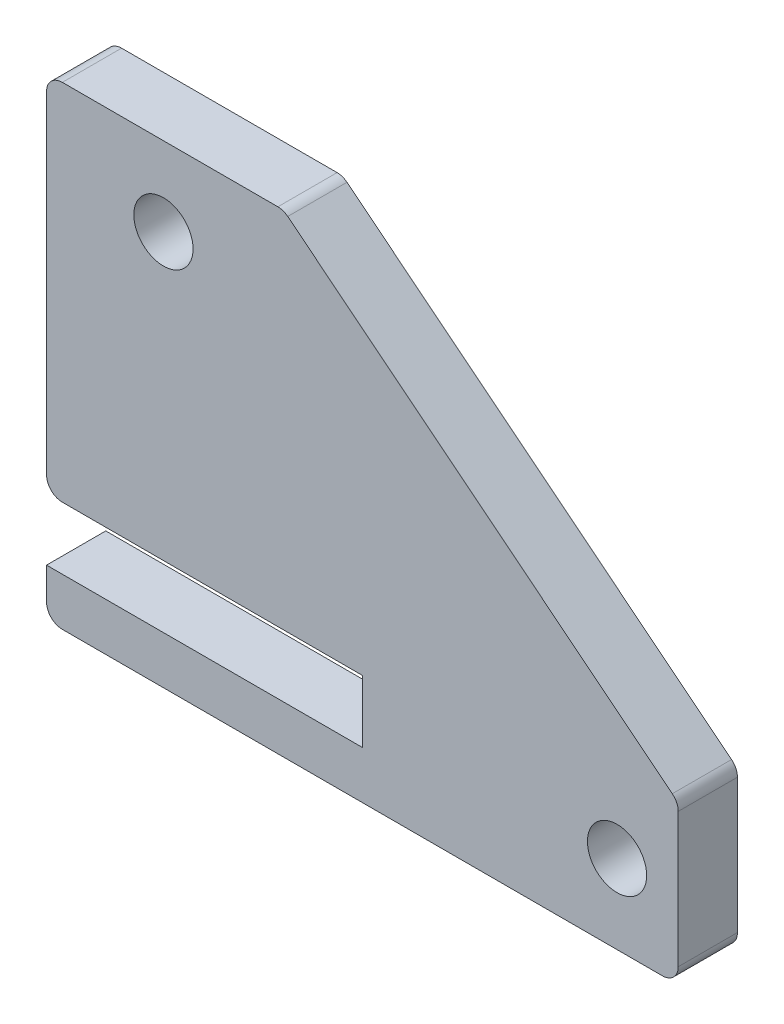
ISO-10303-21;
HEADER;
FILE_DESCRIPTION(('STEP AP214'),'2;1');
FILE_NAME('part.step','',(''),(''),'','','');
FILE_SCHEMA(('AUTOMOTIVE_DESIGN { 1 0 10303 214 1 1 1 1 }'));
ENDSEC;
DATA;
#1=APPLICATION_CONTEXT('core data for automotive mechanical design processes');
#2=APPLICATION_PROTOCOL_DEFINITION('international standard','automotive_design',2000,#1);
#3=PRODUCT_CONTEXT('',#1,'mechanical');
#4=PRODUCT('Part','Part','',(#3));
#5=PRODUCT_RELATED_PRODUCT_CATEGORY('part','',(#4));
#6=PRODUCT_DEFINITION_FORMATION('','',#4);
#7=PRODUCT_DEFINITION_CONTEXT('part definition',#1,'design');
#8=PRODUCT_DEFINITION('design','',#6,#7);
#9=PRODUCT_DEFINITION_SHAPE('','',#8);
#10=(LENGTH_UNIT() NAMED_UNIT(*) SI_UNIT(.MILLI.,.METRE.));
#11=(NAMED_UNIT(*) PLANE_ANGLE_UNIT() SI_UNIT($,.RADIAN.));
#12=(NAMED_UNIT(*) SI_UNIT($,.STERADIAN.) SOLID_ANGLE_UNIT());
#13=UNCERTAINTY_MEASURE_WITH_UNIT(LENGTH_MEASURE(1.E-05),#10,'distance_accuracy_value','');
#14=(GEOMETRIC_REPRESENTATION_CONTEXT(3) GLOBAL_UNCERTAINTY_ASSIGNED_CONTEXT((#13)) GLOBAL_UNIT_ASSIGNED_CONTEXT((#10,
#11,#12)) REPRESENTATION_CONTEXT('',''));
#15=CARTESIAN_POINT('',(0.,0.,0.));
#16=DIRECTION('',(0.,0.,1.));
#17=DIRECTION('',(1.,0.,0.));
#18=AXIS2_PLACEMENT_3D('',#15,#16,#17);
#19=CARTESIAN_POINT('',(-25.4,0.,2.38125));
#20=DIRECTION('',(-1.,0.,0.));
#21=DIRECTION('',(0.,0.,1.));
#22=AXIS2_PLACEMENT_3D('',#19,#20,#21);
#23=PLANE('',#22);
#24=DIRECTION('',(0.,1.,0.));
#25=VECTOR('',#24,1.);
#26=CARTESIAN_POINT('',(-25.4,0.,-2.38125));
#27=LINE('',#26,#25);
#28=CARTESIAN_POINT('',(-25.4,3.77825,-2.38125));
#29=VERTEX_POINT('',#28);
#30=CARTESIAN_POINT('',(-25.4,30.48,-2.38125));
#31=VERTEX_POINT('',#30);
#32=EDGE_CURVE('E188',#29,#31,#27,.T.);
#33=ORIENTED_EDGE('',*,*,#32,.F.);
#34=DIRECTION('',(0.,0.,-1.));
#35=VECTOR('',#34,1.);
#36=CARTESIAN_POINT('',(-25.4,3.77825,2.38125));
#37=LINE('',#36,#35);
#38=CARTESIAN_POINT('',(-25.4,3.77825,2.38125));
#39=VERTEX_POINT('',#38);
#40=EDGE_CURVE('E250',#29,#39,#37,.F.);
#41=ORIENTED_EDGE('',*,*,#40,.T.);
#42=DIRECTION('',(0.,1.,0.));
#43=VECTOR('',#42,1.);
#44=CARTESIAN_POINT('',(-25.4,0.,2.38125));
#45=LINE('',#44,#43);
#46=CARTESIAN_POINT('',(-25.4,30.48,2.38125));
#47=VERTEX_POINT('',#46);
#48=EDGE_CURVE('E158',#39,#47,#45,.T.);
#49=ORIENTED_EDGE('',*,*,#48,.T.);
#50=DIRECTION('',(0.,0.,-1.));
#51=VECTOR('',#50,1.);
#52=CARTESIAN_POINT('',(-25.4,30.48,2.38125));
#53=LINE('',#52,#51);
#54=EDGE_CURVE('E248',#47,#31,#53,.T.);
#55=ORIENTED_EDGE('',*,*,#54,.T.);
#56=EDGE_LOOP('',(#33,#41,#49,#55));
#57=FACE_BOUND('',#56,.T.);
#58=ADVANCED_FACE('F35',(#57),#23,.T.);
#59=CARTESIAN_POINT('',(0.,2.50825,2.38125));
#60=DIRECTION('',(0.,1.,0.));
#61=DIRECTION('',(0.,0.,1.));
#62=AXIS2_PLACEMENT_3D('',#59,#60,#61);
#63=PLANE('',#62);
#64=DIRECTION('',(1.,0.,0.));
#65=VECTOR('',#64,1.);
#66=CARTESIAN_POINT('',(0.,2.50825,2.38125));
#67=LINE('',#66,#65);
#68=CARTESIAN_POINT('',(-24.13,2.50825,2.38125));
#69=VERTEX_POINT('',#68);
#70=CARTESIAN_POINT('',(0.,2.50825,2.38125));
#71=VERTEX_POINT('',#70);
#72=EDGE_CURVE('E143',#69,#71,#67,.T.);
#73=ORIENTED_EDGE('',*,*,#72,.F.);
#74=DIRECTION('',(0.,0.,-1.));
#75=VECTOR('',#74,1.);
#76=CARTESIAN_POINT('',(-24.13,2.50825,-2.38125));
#77=LINE('',#76,#75);
#78=CARTESIAN_POINT('',(-24.13,2.50825,-2.38125));
#79=VERTEX_POINT('',#78);
#80=EDGE_CURVE('E246',#69,#79,#77,.T.);
#81=ORIENTED_EDGE('',*,*,#80,.T.);
#82=DIRECTION('',(1.,0.,0.));
#83=VECTOR('',#82,1.);
#84=CARTESIAN_POINT('',(0.,2.50825,-2.38125));
#85=LINE('',#84,#83);
#86=CARTESIAN_POINT('',(0.,2.50825,-2.38125));
#87=VERTEX_POINT('',#86);
#88=EDGE_CURVE('E163',#79,#87,#85,.T.);
#89=ORIENTED_EDGE('',*,*,#88,.T.);
#90=DIRECTION('',(0.,0.,-1.));
#91=VECTOR('',#90,1.);
#92=CARTESIAN_POINT('',(0.,2.50825,2.38125));
#93=LINE('',#92,#91);
#94=EDGE_CURVE('E161',#71,#87,#93,.T.);
#95=ORIENTED_EDGE('',*,*,#94,.F.);
#96=EDGE_LOOP('',(#73,#81,#89,#95));
#97=FACE_BOUND('',#96,.T.);
#98=ADVANCED_FACE('F162',(#97),#63,.F.);
#99=CARTESIAN_POINT('',(0.,0.,2.38125));
#100=DIRECTION('',(-1.,0.,0.));
#101=DIRECTION('',(0.,0.,1.));
#102=AXIS2_PLACEMENT_3D('',#99,#100,#101);
#103=PLANE('',#102);
#104=DIRECTION('',(0.,1.,0.));
#105=VECTOR('',#104,1.);
#106=CARTESIAN_POINT('',(0.,0.,-2.38125));
#107=LINE('',#106,#105);
#108=CARTESIAN_POINT('',(0.,-2.50825,-2.38125));
#109=VERTEX_POINT('',#108);
#110=EDGE_CURVE('E192',#109,#87,#107,.T.);
#111=ORIENTED_EDGE('',*,*,#110,.F.);
#112=DIRECTION('',(0.,0.,-1.));
#113=VECTOR('',#112,1.);
#114=CARTESIAN_POINT('',(0.,-2.50825,2.38125));
#115=LINE('',#114,#113);
#116=CARTESIAN_POINT('',(0.,-2.50825,2.38125));
#117=VERTEX_POINT('',#116);
#118=EDGE_CURVE('E168',#117,#109,#115,.T.);
#119=ORIENTED_EDGE('',*,*,#118,.F.);
#120=DIRECTION('',(0.,1.,0.));
#121=VECTOR('',#120,1.);
#122=CARTESIAN_POINT('',(0.,0.,2.38125));
#123=LINE('',#122,#121);
#124=EDGE_CURVE('E150',#117,#71,#123,.T.);
#125=ORIENTED_EDGE('',*,*,#124,.T.);
#126=ORIENTED_EDGE('',*,*,#94,.T.);
#127=EDGE_LOOP('',(#111,#119,#125,#126));
#128=FACE_BOUND('',#127,.T.);
#129=ADVANCED_FACE('F170',(#128),#103,.T.);
#130=CARTESIAN_POINT('',(0.,-2.50825,2.38125));
#131=DIRECTION('',(0.,1.,0.));
#132=DIRECTION('',(0.,0.,1.));
#133=AXIS2_PLACEMENT_3D('',#130,#131,#132);
#134=PLANE('',#133);
#135=DIRECTION('',(1.,0.,0.));
#136=VECTOR('',#135,1.);
#137=CARTESIAN_POINT('',(0.,-2.50825,-2.38125));
#138=LINE('',#137,#136);
#139=CARTESIAN_POINT('',(-25.4,-2.50825,-2.38125));
#140=VERTEX_POINT('',#139);
#141=EDGE_CURVE('E194',#140,#109,#138,.T.);
#142=ORIENTED_EDGE('',*,*,#141,.F.);
#143=DIRECTION('',(0.,0.,-1.));
#144=VECTOR('',#143,1.);
#145=CARTESIAN_POINT('',(-25.4,-2.50825,2.38125));
#146=LINE('',#145,#144);
#147=CARTESIAN_POINT('',(-25.4,-2.50825,2.38125));
#148=VERTEX_POINT('',#147);
#149=EDGE_CURVE('E187',#148,#140,#146,.T.);
#150=ORIENTED_EDGE('',*,*,#149,.F.);
#151=DIRECTION('',(1.,0.,0.));
#152=VECTOR('',#151,1.);
#153=CARTESIAN_POINT('',(0.,-2.50825,2.38125));
#154=LINE('',#153,#152);
#155=EDGE_CURVE('E171',#148,#117,#154,.T.);
#156=ORIENTED_EDGE('',*,*,#155,.T.);
#157=ORIENTED_EDGE('',*,*,#118,.T.);
#158=EDGE_LOOP('',(#142,#150,#156,#157));
#159=FACE_BOUND('',#158,.T.);
#160=ADVANCED_FACE('F282',(#159),#134,.T.);
#161=CARTESIAN_POINT('',(-25.4,0.,2.38125));
#162=DIRECTION('',(1.,0.,0.));
#163=DIRECTION('',(0.,0.,-1.));
#164=AXIS2_PLACEMENT_3D('',#161,#162,#163);
#165=PLANE('',#164);
#166=DIRECTION('',(0.,-1.,0.));
#167=VECTOR('',#166,1.);
#168=CARTESIAN_POINT('',(-25.4,0.,-2.38125));
#169=LINE('',#168,#167);
#170=CARTESIAN_POINT('',(-25.4,-5.08,-2.38125));
#171=VERTEX_POINT('',#170);
#172=EDGE_CURVE('E197',#140,#171,#169,.T.);
#173=ORIENTED_EDGE('',*,*,#172,.T.);
#174=DIRECTION('',(0.,0.,-1.));
#175=VECTOR('',#174,1.);
#176=CARTESIAN_POINT('',(-25.4,-5.08,2.38125));
#177=LINE('',#176,#175);
#178=CARTESIAN_POINT('',(-25.4,-5.08,2.38125));
#179=VERTEX_POINT('',#178);
#180=EDGE_CURVE('E11',#171,#179,#177,.F.);
#181=ORIENTED_EDGE('',*,*,#180,.T.);
#182=DIRECTION('',(0.,-1.,0.));
#183=VECTOR('',#182,1.);
#184=CARTESIAN_POINT('',(-25.4,0.,2.38125));
#185=LINE('',#184,#183);
#186=EDGE_CURVE('E173',#148,#179,#185,.T.);
#187=ORIENTED_EDGE('',*,*,#186,.F.);
#188=ORIENTED_EDGE('',*,*,#149,.T.);
#189=EDGE_LOOP('',(#173,#181,#187,#188));
#190=FACE_BOUND('',#189,.T.);
#191=ADVANCED_FACE('F279',(#190),#165,.F.);
#192=CARTESIAN_POINT('',(0.,-6.35,2.38125));
#193=DIRECTION('',(0.,1.,0.));
#194=DIRECTION('',(0.,0.,1.));
#195=AXIS2_PLACEMENT_3D('',#192,#193,#194);
#196=PLANE('',#195);
#197=DIRECTION('',(1.,0.,0.));
#198=VECTOR('',#197,1.);
#199=CARTESIAN_POINT('',(0.,-6.35,2.38125));
#200=LINE('',#199,#198);
#201=CARTESIAN_POINT('',(-24.13,-6.35,2.38125));
#202=VERTEX_POINT('',#201);
#203=CARTESIAN_POINT('',(24.13,-6.35,2.38125));
#204=VERTEX_POINT('',#203);
#205=EDGE_CURVE('E179',#202,#204,#200,.T.);
#206=ORIENTED_EDGE('',*,*,#205,.F.);
#207=DIRECTION('',(0.,0.,-1.));
#208=VECTOR('',#207,1.);
#209=CARTESIAN_POINT('',(-24.13,-6.35,2.38125));
#210=LINE('',#209,#208);
#211=CARTESIAN_POINT('',(-24.13,-6.35,-2.38125));
#212=VERTEX_POINT('',#211);
#213=EDGE_CURVE('E43',#202,#212,#210,.T.);
#214=ORIENTED_EDGE('',*,*,#213,.T.);
#215=DIRECTION('',(1.,0.,0.));
#216=VECTOR('',#215,1.);
#217=CARTESIAN_POINT('',(0.,-6.35,-2.38125));
#218=LINE('',#217,#216);
#219=CARTESIAN_POINT('',(24.13,-6.35,-2.38125));
#220=VERTEX_POINT('',#219);
#221=EDGE_CURVE('E200',#212,#220,#218,.T.);
#222=ORIENTED_EDGE('',*,*,#221,.T.);
#223=DIRECTION('',(0.,0.,-1.));
#224=VECTOR('',#223,1.);
#225=CARTESIAN_POINT('',(24.13,-6.35,2.38125));
#226=LINE('',#225,#224);
#227=EDGE_CURVE('E252',#220,#204,#226,.F.);
#228=ORIENTED_EDGE('',*,*,#227,.T.);
#229=EDGE_LOOP('',(#206,#214,#222,#228));
#230=FACE_BOUND('',#229,.T.);
#231=ADVANCED_FACE('F258',(#230),#196,.F.);
#232=CARTESIAN_POINT('',(25.4,0.,2.38125));
#233=DIRECTION('',(-1.,0.,0.));
#234=DIRECTION('',(0.,0.,1.));
#235=AXIS2_PLACEMENT_3D('',#232,#233,#234);
#236=PLANE('',#235);
#237=DIRECTION('',(0.,1.,0.));
#238=VECTOR('',#237,1.);
#239=CARTESIAN_POINT('',(25.4,0.,-2.38125));
#240=LINE('',#239,#238);
#241=CARTESIAN_POINT('',(25.4,-5.08,-2.38125));
#242=VERTEX_POINT('',#241);
#243=CARTESIAN_POINT('',(25.4,5.73960644369206,-2.38125));
#244=VERTEX_POINT('',#243);
#245=EDGE_CURVE('E203',#242,#244,#240,.T.);
#246=ORIENTED_EDGE('',*,*,#245,.T.);
#247=DIRECTION('',(0.,0.,1.));
#248=VECTOR('',#247,1.);
#249=CARTESIAN_POINT('',(25.4,5.73960644369206,2.38125));
#250=LINE('',#249,#248);
#251=CARTESIAN_POINT('',(25.4,5.73960644369206,2.38125));
#252=VERTEX_POINT('',#251);
#253=EDGE_CURVE('E213',#244,#252,#250,.T.);
#254=ORIENTED_EDGE('',*,*,#253,.T.);
#255=DIRECTION('',(0.,1.,0.));
#256=VECTOR('',#255,1.);
#257=CARTESIAN_POINT('',(25.4,0.,2.38125));
#258=LINE('',#257,#256);
#259=CARTESIAN_POINT('',(25.4,-5.08,2.38125));
#260=VERTEX_POINT('',#259);
#261=EDGE_CURVE('E182',#260,#252,#258,.T.);
#262=ORIENTED_EDGE('',*,*,#261,.F.);
#263=DIRECTION('',(0.,0.,-1.));
#264=VECTOR('',#263,1.);
#265=CARTESIAN_POINT('',(25.4,-5.08,2.38125));
#266=LINE('',#265,#264);
#267=EDGE_CURVE('E167',#260,#242,#266,.T.);
#268=ORIENTED_EDGE('',*,*,#267,.T.);
#269=EDGE_LOOP('',(#246,#254,#262,#268));
#270=FACE_BOUND('',#269,.T.);
#271=ADVANCED_FACE('F271',(#270),#236,.F.);
#272=CARTESIAN_POINT('',(0.,31.75,2.38125));
#273=DIRECTION('',(0.,1.,0.));
#274=DIRECTION('',(0.,0.,1.));
#275=AXIS2_PLACEMENT_3D('',#272,#273,#274);
#276=PLANE('',#275);
#277=DIRECTION('',(1.,0.,0.));
#278=VECTOR('',#277,1.);
#279=CARTESIAN_POINT('',(0.,31.75,2.38125));
#280=LINE('',#279,#278);
#281=CARTESIAN_POINT('',(-24.13,31.75,2.38125));
#282=VERTEX_POINT('',#281);
#283=CARTESIAN_POINT('',(-6.79549194538493,31.75,2.38125));
#284=VERTEX_POINT('',#283);
#285=EDGE_CURVE('E184',#282,#284,#280,.T.);
#286=ORIENTED_EDGE('',*,*,#285,.T.);
#287=DIRECTION('',(0.,0.,1.));
#288=VECTOR('',#287,1.);
#289=CARTESIAN_POINT('',(-6.79549194538493,31.75,-2.38125));
#290=LINE('',#289,#288);
#291=CARTESIAN_POINT('',(-6.79549194538493,31.75,-2.38125));
#292=VERTEX_POINT('',#291);
#293=EDGE_CURVE('E244',#284,#292,#290,.F.);
#294=ORIENTED_EDGE('',*,*,#293,.T.);
#295=DIRECTION('',(1.,0.,0.));
#296=VECTOR('',#295,1.);
#297=CARTESIAN_POINT('',(0.,31.75,-2.38125));
#298=LINE('',#297,#296);
#299=CARTESIAN_POINT('',(-24.13,31.75,-2.38125));
#300=VERTEX_POINT('',#299);
#301=EDGE_CURVE('E206',#300,#292,#298,.T.);
#302=ORIENTED_EDGE('',*,*,#301,.F.);
#303=DIRECTION('',(0.,0.,-1.));
#304=VECTOR('',#303,1.);
#305=CARTESIAN_POINT('',(-24.13,31.75,2.38125));
#306=LINE('',#305,#304);
#307=EDGE_CURVE('E242',#300,#282,#306,.F.);
#308=ORIENTED_EDGE('',*,*,#307,.T.);
#309=EDGE_LOOP('',(#286,#294,#302,#308));
#310=FACE_BOUND('',#309,.T.);
#311=ADVANCED_FACE('F382',(#310),#276,.T.);
#312=CARTESIAN_POINT('',(0.,0.,2.38125));
#313=DIRECTION('',(0.,0.,1.));
#314=DIRECTION('',(1.,0.,0.));
#315=AXIS2_PLACEMENT_3D('',#312,#313,#314);
#316=PLANE('',#315);
#317=ORIENTED_EDGE('',*,*,#261,.T.);
#318=CARTESIAN_POINT('',(24.13,5.73960644369206,2.38125));
#319=DIRECTION('',(0.,0.,1.));
#320=DIRECTION('',(1.,0.,0.));
#321=AXIS2_PLACEMENT_3D('',#318,#319,#320);
#322=CIRCLE('',#321,1.27);
#323=CARTESIAN_POINT('',(24.9233627103941,6.7313098316847,2.38125));
#324=VERTEX_POINT('',#323);
#325=EDGE_CURVE('E225',#252,#324,#322,.T.);
#326=ORIENTED_EDGE('',*,*,#325,.T.);
#327=DIRECTION('',(0.78086880944303,-0.624695047554424,0.));
#328=VECTOR('',#327,1.);
#329=CARTESIAN_POINT('',(-6.35,31.75,2.38125));
#330=LINE('',#329,#328);
#331=CARTESIAN_POINT('',(-6.00212923499081,31.4717033879926,2.38125));
#332=VERTEX_POINT('',#331);
#333=EDGE_CURVE('E482',#332,#324,#330,.T.);
#334=ORIENTED_EDGE('',*,*,#333,.F.);
#335=CARTESIAN_POINT('',(-6.79549194538493,30.48,2.38125));
#336=DIRECTION('',(0.,0.,1.));
#337=DIRECTION('',(1.,0.,0.));
#338=AXIS2_PLACEMENT_3D('',#335,#336,#337);
#339=CIRCLE('',#338,1.27);
#340=EDGE_CURVE('E223',#332,#284,#339,.T.);
#341=ORIENTED_EDGE('',*,*,#340,.T.);
#342=ORIENTED_EDGE('',*,*,#285,.F.);
#343=CARTESIAN_POINT('',(-24.13,30.48,2.38125));
#344=DIRECTION('',(0.,0.,1.));
#345=DIRECTION('',(1.,0.,0.));
#346=AXIS2_PLACEMENT_3D('',#343,#344,#345);
#347=CIRCLE('',#346,1.27);
#348=EDGE_CURVE('E220',#282,#47,#347,.T.);
#349=ORIENTED_EDGE('',*,*,#348,.T.);
#350=ORIENTED_EDGE('',*,*,#48,.F.);
#351=CARTESIAN_POINT('',(-24.13,3.77825,2.38125));
#352=DIRECTION('',(0.,0.,1.));
#353=DIRECTION('',(1.,0.,0.));
#354=AXIS2_PLACEMENT_3D('',#351,#352,#353);
#355=CIRCLE('',#354,1.27);
#356=EDGE_CURVE('E154',#39,#69,#355,.T.);
#357=ORIENTED_EDGE('',*,*,#356,.T.);
#358=ORIENTED_EDGE('',*,*,#72,.T.);
#359=ORIENTED_EDGE('',*,*,#124,.F.);
#360=ORIENTED_EDGE('',*,*,#155,.F.);
#361=ORIENTED_EDGE('',*,*,#186,.T.);
#362=CARTESIAN_POINT('',(-24.13,-5.08,2.38125));
#363=DIRECTION('',(0.,0.,1.));
#364=DIRECTION('',(1.,0.,0.));
#365=AXIS2_PLACEMENT_3D('',#362,#363,#364);
#366=CIRCLE('',#365,1.27);
#367=EDGE_CURVE('E218',#179,#202,#366,.T.);
#368=ORIENTED_EDGE('',*,*,#367,.T.);
#369=ORIENTED_EDGE('',*,*,#205,.T.);
#370=CARTESIAN_POINT('',(24.13,-5.08,2.38125));
#371=DIRECTION('',(0.,0.,1.));
#372=DIRECTION('',(1.,0.,0.));
#373=AXIS2_PLACEMENT_3D('',#370,#371,#372);
#374=CIRCLE('',#373,1.27);
#375=EDGE_CURVE('E216',#204,#260,#374,.T.);
#376=ORIENTED_EDGE('',*,*,#375,.T.);
#377=EDGE_LOOP('',(#317,#326,#334,#341,#342,#349,#350,#357,#358,#359,#360,#361,#368,#369,#376));
#378=FACE_BOUND('',#377,.T.);
#379=CARTESIAN_POINT('',(-15.9992228055165,25.4,2.38125));
#380=DIRECTION('',(0.,0.,1.));
#381=DIRECTION('',(1.,0.,0.));
#382=AXIS2_PLACEMENT_3D('',#379,#380,#381);
#383=CIRCLE('',#382,2.38125);
#384=CARTESIAN_POINT('',(-13.6179728055165,25.4,2.38125));
#385=VERTEX_POINT('',#384);
#386=EDGE_CURVE('E467',#385,#385,#383,.T.);
#387=ORIENTED_EDGE('',*,*,#386,.F.);
#388=EDGE_LOOP('',(#387));
#389=FACE_BOUND('',#388,.T.);
#390=CARTESIAN_POINT('',(20.47875,0.,2.38125));
#391=DIRECTION('',(0.,0.,1.));
#392=DIRECTION('',(1.,0.,0.));
#393=AXIS2_PLACEMENT_3D('',#390,#391,#392);
#394=CIRCLE('',#393,2.38125);
#395=CARTESIAN_POINT('',(22.86,0.,2.38125));
#396=VERTEX_POINT('',#395);
#397=EDGE_CURVE('E461',#396,#396,#394,.T.);
#398=ORIENTED_EDGE('',*,*,#397,.F.);
#399=EDGE_LOOP('',(#398));
#400=FACE_BOUND('',#399,.T.);
#401=ADVANCED_FACE('F146',(#378,#389,#400),#316,.T.);
#402=CARTESIAN_POINT('',(0.,0.,-2.38125));
#403=DIRECTION('',(0.,0.,1.));
#404=DIRECTION('',(1.,0.,0.));
#405=AXIS2_PLACEMENT_3D('',#402,#403,#404);
#406=PLANE('',#405);
#407=CARTESIAN_POINT('',(-15.9992228055165,25.4,-2.38125));
#408=DIRECTION('',(0.,0.,1.));
#409=DIRECTION('',(1.,0.,0.));
#410=AXIS2_PLACEMENT_3D('',#407,#408,#409);
#411=CIRCLE('',#410,2.38125);
#412=CARTESIAN_POINT('',(-13.6179728055165,25.4,-2.38125));
#413=VERTEX_POINT('',#412);
#414=EDGE_CURVE('E463',#413,#413,#411,.T.);
#415=ORIENTED_EDGE('',*,*,#414,.T.);
#416=EDGE_LOOP('',(#415));
#417=FACE_BOUND('',#416,.T.);
#418=CARTESIAN_POINT('',(20.47875,0.,-2.38125));
#419=DIRECTION('',(0.,0.,1.));
#420=DIRECTION('',(1.,0.,0.));
#421=AXIS2_PLACEMENT_3D('',#418,#419,#420);
#422=CIRCLE('',#421,2.38125);
#423=CARTESIAN_POINT('',(22.86,0.,-2.38125));
#424=VERTEX_POINT('',#423);
#425=EDGE_CURVE('E190',#424,#424,#422,.T.);
#426=ORIENTED_EDGE('',*,*,#425,.T.);
#427=EDGE_LOOP('',(#426));
#428=FACE_BOUND('',#427,.T.);
#429=DIRECTION('',(0.78086880944303,-0.624695047554424,0.));
#430=VECTOR('',#429,1.);
#431=CARTESIAN_POINT('',(-6.35,31.75,-2.38125));
#432=LINE('',#431,#430);
#433=CARTESIAN_POINT('',(-6.00212923499081,31.4717033879926,-2.38125));
#434=VERTEX_POINT('',#433);
#435=CARTESIAN_POINT('',(24.9233627103941,6.7313098316847,-2.38125));
#436=VERTEX_POINT('',#435);
#437=EDGE_CURVE('E479',#434,#436,#432,.T.);
#438=ORIENTED_EDGE('',*,*,#437,.T.);
#439=CARTESIAN_POINT('',(24.13,5.73960644369206,-2.38125));
#440=DIRECTION('',(0.,0.,1.));
#441=DIRECTION('',(1.,0.,0.));
#442=AXIS2_PLACEMENT_3D('',#439,#440,#441);
#443=CIRCLE('',#442,1.27);
#444=EDGE_CURVE('E240',#436,#244,#443,.F.);
#445=ORIENTED_EDGE('',*,*,#444,.T.);
#446=ORIENTED_EDGE('',*,*,#245,.F.);
#447=CARTESIAN_POINT('',(24.13,-5.08,-2.38125));
#448=DIRECTION('',(0.,0.,1.));
#449=DIRECTION('',(1.,0.,0.));
#450=AXIS2_PLACEMENT_3D('',#447,#448,#449);
#451=CIRCLE('',#450,1.27);
#452=EDGE_CURVE('E232',#242,#220,#451,.F.);
#453=ORIENTED_EDGE('',*,*,#452,.T.);
#454=ORIENTED_EDGE('',*,*,#221,.F.);
#455=CARTESIAN_POINT('',(-24.13,-5.08,-2.38125));
#456=DIRECTION('',(0.,0.,1.));
#457=DIRECTION('',(1.,0.,0.));
#458=AXIS2_PLACEMENT_3D('',#455,#456,#457);
#459=CIRCLE('',#458,1.27);
#460=EDGE_CURVE('E234',#212,#171,#459,.F.);
#461=ORIENTED_EDGE('',*,*,#460,.T.);
#462=ORIENTED_EDGE('',*,*,#172,.F.);
#463=ORIENTED_EDGE('',*,*,#141,.T.);
#464=ORIENTED_EDGE('',*,*,#110,.T.);
#465=ORIENTED_EDGE('',*,*,#88,.F.);
#466=CARTESIAN_POINT('',(-24.13,3.77825,-2.38125));
#467=DIRECTION('',(0.,0.,1.));
#468=DIRECTION('',(1.,0.,0.));
#469=AXIS2_PLACEMENT_3D('',#466,#467,#468);
#470=CIRCLE('',#469,1.27);
#471=EDGE_CURVE('E58',#79,#29,#470,.F.);
#472=ORIENTED_EDGE('',*,*,#471,.T.);
#473=ORIENTED_EDGE('',*,*,#32,.T.);
#474=CARTESIAN_POINT('',(-24.13,30.48,-2.38125));
#475=DIRECTION('',(0.,0.,1.));
#476=DIRECTION('',(1.,0.,0.));
#477=AXIS2_PLACEMENT_3D('',#474,#475,#476);
#478=CIRCLE('',#477,1.27);
#479=EDGE_CURVE('E50',#31,#300,#478,.F.);
#480=ORIENTED_EDGE('',*,*,#479,.T.);
#481=ORIENTED_EDGE('',*,*,#301,.T.);
#482=CARTESIAN_POINT('',(-6.79549194538493,30.48,-2.38125));
#483=DIRECTION('',(0.,0.,1.));
#484=DIRECTION('',(1.,0.,0.));
#485=AXIS2_PLACEMENT_3D('',#482,#483,#484);
#486=CIRCLE('',#485,1.27);
#487=EDGE_CURVE('E238',#292,#434,#486,.F.);
#488=ORIENTED_EDGE('',*,*,#487,.T.);
#489=EDGE_LOOP('',(#438,#445,#446,#453,#454,#461,#462,#463,#464,#465,#472,#473,#480,#481,#488));
#490=FACE_BOUND('',#489,.T.);
#491=ADVANCED_FACE('F263',(#417,#428,#490),#406,.F.);
#492=CARTESIAN_POINT('',(20.47875,0.,-2.38125));
#493=DIRECTION('',(0.,0.,1.));
#494=DIRECTION('',(1.,0.,0.));
#495=AXIS2_PLACEMENT_3D('',#492,#493,#494);
#496=CYLINDRICAL_SURFACE('',#495,2.38125);
#497=CARTESIAN_POINT('',(22.86,0.,-2.38125));
#498=CARTESIAN_POINT('',(22.86,0.,-2.331640625));
#499=CARTESIAN_POINT('',(22.86,0.,-2.28203125));
#500=CARTESIAN_POINT('',(22.86,0.,-2.1828125));
#501=CARTESIAN_POINT('',(22.86,0.,-2.133203125));
#502=CARTESIAN_POINT('',(22.86,0.,-2.033984375));
#503=CARTESIAN_POINT('',(22.86,0.,-1.984375));
#504=CARTESIAN_POINT('',(22.86,0.,-1.88515625));
#505=CARTESIAN_POINT('',(22.86,0.,-1.835546875));
#506=CARTESIAN_POINT('',(22.86,0.,-1.736328125));
#507=CARTESIAN_POINT('',(22.86,0.,-1.68671875));
#508=CARTESIAN_POINT('',(22.86,0.,-1.5875));
#509=CARTESIAN_POINT('',(22.86,0.,-1.537890625));
#510=CARTESIAN_POINT('',(22.86,0.,-1.438671875));
#511=CARTESIAN_POINT('',(22.86,0.,-1.3890625));
#512=CARTESIAN_POINT('',(22.86,0.,-1.28984375));
#513=CARTESIAN_POINT('',(22.86,0.,-1.240234375));
#514=CARTESIAN_POINT('',(22.86,0.,-1.141015625));
#515=CARTESIAN_POINT('',(22.86,0.,-1.09140625));
#516=CARTESIAN_POINT('',(22.86,0.,-0.9921875));
#517=CARTESIAN_POINT('',(22.86,0.,-0.942578125));
#518=CARTESIAN_POINT('',(22.86,0.,-0.843359375));
#519=CARTESIAN_POINT('',(22.86,0.,-0.79375));
#520=CARTESIAN_POINT('',(22.86,0.,-0.69453125));
#521=CARTESIAN_POINT('',(22.86,0.,-0.644921875));
#522=CARTESIAN_POINT('',(22.86,0.,-0.545703125));
#523=CARTESIAN_POINT('',(22.86,0.,-0.49609375));
#524=CARTESIAN_POINT('',(22.86,0.,-0.396875));
#525=CARTESIAN_POINT('',(22.86,0.,-0.347265625));
#526=CARTESIAN_POINT('',(22.86,0.,-0.248046875));
#527=CARTESIAN_POINT('',(22.86,0.,-0.1984375));
#528=CARTESIAN_POINT('',(22.86,0.,-0.09921875));
#529=CARTESIAN_POINT('',(22.86,0.,-0.049609375));
#530=CARTESIAN_POINT('',(22.86,0.,0.049609375));
#531=CARTESIAN_POINT('',(22.86,0.,0.09921875));
#532=CARTESIAN_POINT('',(22.86,0.,0.1984375));
#533=CARTESIAN_POINT('',(22.86,0.,0.248046875));
#534=CARTESIAN_POINT('',(22.86,0.,0.347265625));
#535=CARTESIAN_POINT('',(22.86,0.,0.396875));
#536=CARTESIAN_POINT('',(22.86,0.,0.49609375));
#537=CARTESIAN_POINT('',(22.86,0.,0.545703125));
#538=CARTESIAN_POINT('',(22.86,0.,0.644921875));
#539=CARTESIAN_POINT('',(22.86,0.,0.69453125));
#540=CARTESIAN_POINT('',(22.86,0.,0.79375));
#541=CARTESIAN_POINT('',(22.86,0.,0.843359375));
#542=CARTESIAN_POINT('',(22.86,0.,0.942578125));
#543=CARTESIAN_POINT('',(22.86,0.,0.9921875));
#544=CARTESIAN_POINT('',(22.86,0.,1.09140625));
#545=CARTESIAN_POINT('',(22.86,0.,1.141015625));
#546=CARTESIAN_POINT('',(22.86,0.,1.240234375));
#547=CARTESIAN_POINT('',(22.86,0.,1.28984375));
#548=CARTESIAN_POINT('',(22.86,0.,1.3890625));
#549=CARTESIAN_POINT('',(22.86,0.,1.438671875));
#550=CARTESIAN_POINT('',(22.86,0.,1.537890625));
#551=CARTESIAN_POINT('',(22.86,0.,1.5875));
#552=CARTESIAN_POINT('',(22.86,0.,1.68671875));
#553=CARTESIAN_POINT('',(22.86,0.,1.736328125));
#554=CARTESIAN_POINT('',(22.86,0.,1.835546875));
#555=CARTESIAN_POINT('',(22.86,0.,1.88515625));
#556=CARTESIAN_POINT('',(22.86,0.,1.984375));
#557=CARTESIAN_POINT('',(22.86,0.,2.033984375));
#558=CARTESIAN_POINT('',(22.86,0.,2.133203125));
#559=CARTESIAN_POINT('',(22.86,0.,2.1828125));
#560=CARTESIAN_POINT('',(22.86,0.,2.28203125));
#561=CARTESIAN_POINT('',(22.86,0.,2.331640625));
#562=CARTESIAN_POINT('',(22.86,0.,2.38125));
#563=B_SPLINE_CURVE_WITH_KNOTS('',3,(#497,#498,#499,#500,#501,#502,#503,#504,#505,#506,#507,
#508,#509,#510,#511,#512,#513,#514,#515,#516,#517,#518,#519,#520,#521,#522,#523,#524,#525,#526,
#527,#528,#529,#530,#531,#532,#533,#534,#535,#536,#537,#538,#539,#540,#541,#542,#543,#544,#545,
#546,#547,#548,#549,#550,#551,#552,#553,#554,#555,#556,#557,#558,#559,#560,#561,#562),
.UNSPECIFIED.,.F.,.F.,(4,2,2,2,2,2,2,2,2,2,2,2,2,2,2,2,2,2,2,2,2,2,2,2,2,2,2,2,2,2,2,2,4),(0.,
0.148828125,0.29765625,0.446484375,0.5953125,0.744140625,0.89296875,1.041796875,1.190625,
1.339453125,1.48828125,1.637109375,1.7859375,1.934765625,2.08359375,2.232421875,2.38125,
2.530078125,2.67890625,2.827734375,2.9765625,3.125390625,3.27421875,3.423046875,3.571875,
3.720703125,3.86953125,4.018359375,4.1671875,4.316015625,4.46484375,4.613671875,4.7625),.UNSPECIFIED.);
#564=EDGE_CURVE('BSEAM369',#424,#396,#563,.T.);
#565=ORIENTED_EDGE('',*,*,#425,.F.);
#566=ORIENTED_EDGE('',*,*,#397,.T.);
#567=ORIENTED_EDGE('',*,*,#564,.T.);
#568=ORIENTED_EDGE('',*,*,#564,.F.);
#569=EDGE_LOOP('',(#565,#567,#566,#568));
#570=FACE_BOUND('',#569,.T.);
#571=ADVANCED_FACE('F369',(#570),#496,.F.);
#572=CARTESIAN_POINT('',(-15.9992228055165,25.4,-2.38125));
#573=DIRECTION('',(0.,0.,1.));
#574=DIRECTION('',(1.,0.,0.));
#575=AXIS2_PLACEMENT_3D('',#572,#573,#574);
#576=CYLINDRICAL_SURFACE('',#575,2.38125);
#577=CARTESIAN_POINT('',(-13.6179728055165,25.4,-2.38125));
#578=CARTESIAN_POINT('',(-13.6179728055165,25.4,-2.331640625));
#579=CARTESIAN_POINT('',(-13.6179728055165,25.4,-2.28203125));
#580=CARTESIAN_POINT('',(-13.6179728055165,25.4,-2.1828125));
#581=CARTESIAN_POINT('',(-13.6179728055165,25.4,-2.133203125));
#582=CARTESIAN_POINT('',(-13.6179728055165,25.4,-2.033984375));
#583=CARTESIAN_POINT('',(-13.6179728055165,25.4,-1.984375));
#584=CARTESIAN_POINT('',(-13.6179728055165,25.4,-1.88515625));
#585=CARTESIAN_POINT('',(-13.6179728055165,25.4,-1.835546875));
#586=CARTESIAN_POINT('',(-13.6179728055165,25.4,-1.736328125));
#587=CARTESIAN_POINT('',(-13.6179728055165,25.4,-1.68671875));
#588=CARTESIAN_POINT('',(-13.6179728055165,25.4,-1.5875));
#589=CARTESIAN_POINT('',(-13.6179728055165,25.4,-1.537890625));
#590=CARTESIAN_POINT('',(-13.6179728055165,25.4,-1.438671875));
#591=CARTESIAN_POINT('',(-13.6179728055165,25.4,-1.3890625));
#592=CARTESIAN_POINT('',(-13.6179728055165,25.4,-1.28984375));
#593=CARTESIAN_POINT('',(-13.6179728055165,25.4,-1.240234375));
#594=CARTESIAN_POINT('',(-13.6179728055165,25.4,-1.141015625));
#595=CARTESIAN_POINT('',(-13.6179728055165,25.4,-1.09140625));
#596=CARTESIAN_POINT('',(-13.6179728055165,25.4,-0.9921875));
#597=CARTESIAN_POINT('',(-13.6179728055165,25.4,-0.942578125));
#598=CARTESIAN_POINT('',(-13.6179728055165,25.4,-0.843359375));
#599=CARTESIAN_POINT('',(-13.6179728055165,25.4,-0.79375));
#600=CARTESIAN_POINT('',(-13.6179728055165,25.4,-0.69453125));
#601=CARTESIAN_POINT('',(-13.6179728055165,25.4,-0.644921875));
#602=CARTESIAN_POINT('',(-13.6179728055165,25.4,-0.545703125));
#603=CARTESIAN_POINT('',(-13.6179728055165,25.4,-0.49609375));
#604=CARTESIAN_POINT('',(-13.6179728055165,25.4,-0.396875));
#605=CARTESIAN_POINT('',(-13.6179728055165,25.4,-0.347265625));
#606=CARTESIAN_POINT('',(-13.6179728055165,25.4,-0.248046875));
#607=CARTESIAN_POINT('',(-13.6179728055165,25.4,-0.1984375));
#608=CARTESIAN_POINT('',(-13.6179728055165,25.4,-0.09921875));
#609=CARTESIAN_POINT('',(-13.6179728055165,25.4,-0.049609375));
#610=CARTESIAN_POINT('',(-13.6179728055165,25.4,0.049609375));
#611=CARTESIAN_POINT('',(-13.6179728055165,25.4,0.09921875));
#612=CARTESIAN_POINT('',(-13.6179728055165,25.4,0.1984375));
#613=CARTESIAN_POINT('',(-13.6179728055165,25.4,0.248046875));
#614=CARTESIAN_POINT('',(-13.6179728055165,25.4,0.347265625));
#615=CARTESIAN_POINT('',(-13.6179728055165,25.4,0.396875));
#616=CARTESIAN_POINT('',(-13.6179728055165,25.4,0.49609375));
#617=CARTESIAN_POINT('',(-13.6179728055165,25.4,0.545703125));
#618=CARTESIAN_POINT('',(-13.6179728055165,25.4,0.644921875));
#619=CARTESIAN_POINT('',(-13.6179728055165,25.4,0.69453125));
#620=CARTESIAN_POINT('',(-13.6179728055165,25.4,0.79375));
#621=CARTESIAN_POINT('',(-13.6179728055165,25.4,0.843359375));
#622=CARTESIAN_POINT('',(-13.6179728055165,25.4,0.942578125));
#623=CARTESIAN_POINT('',(-13.6179728055165,25.4,0.9921875));
#624=CARTESIAN_POINT('',(-13.6179728055165,25.4,1.09140625));
#625=CARTESIAN_POINT('',(-13.6179728055165,25.4,1.141015625));
#626=CARTESIAN_POINT('',(-13.6179728055165,25.4,1.240234375));
#627=CARTESIAN_POINT('',(-13.6179728055165,25.4,1.28984375));
#628=CARTESIAN_POINT('',(-13.6179728055165,25.4,1.3890625));
#629=CARTESIAN_POINT('',(-13.6179728055165,25.4,1.438671875));
#630=CARTESIAN_POINT('',(-13.6179728055165,25.4,1.537890625));
#631=CARTESIAN_POINT('',(-13.6179728055165,25.4,1.5875));
#632=CARTESIAN_POINT('',(-13.6179728055165,25.4,1.68671875));
#633=CARTESIAN_POINT('',(-13.6179728055165,25.4,1.736328125));
#634=CARTESIAN_POINT('',(-13.6179728055165,25.4,1.835546875));
#635=CARTESIAN_POINT('',(-13.6179728055165,25.4,1.88515625));
#636=CARTESIAN_POINT('',(-13.6179728055165,25.4,1.984375));
#637=CARTESIAN_POINT('',(-13.6179728055165,25.4,2.033984375));
#638=CARTESIAN_POINT('',(-13.6179728055165,25.4,2.133203125));
#639=CARTESIAN_POINT('',(-13.6179728055165,25.4,2.1828125));
#640=CARTESIAN_POINT('',(-13.6179728055165,25.4,2.28203125));
#641=CARTESIAN_POINT('',(-13.6179728055165,25.4,2.331640625));
#642=CARTESIAN_POINT('',(-13.6179728055165,25.4,2.38125));
#643=B_SPLINE_CURVE_WITH_KNOTS('',3,(#577,#578,#579,#580,#581,#582,#583,#584,#585,#586,#587,
#588,#589,#590,#591,#592,#593,#594,#595,#596,#597,#598,#599,#600,#601,#602,#603,#604,#605,#606,
#607,#608,#609,#610,#611,#612,#613,#614,#615,#616,#617,#618,#619,#620,#621,#622,#623,#624,#625,
#626,#627,#628,#629,#630,#631,#632,#633,#634,#635,#636,#637,#638,#639,#640,#641,#642),
.UNSPECIFIED.,.F.,.F.,(4,2,2,2,2,2,2,2,2,2,2,2,2,2,2,2,2,2,2,2,2,2,2,2,2,2,2,2,2,2,2,2,4),(0.,
0.148828125,0.29765625,0.446484375,0.5953125,0.744140625,0.89296875,1.041796875,1.190625,
1.339453125,1.48828125,1.637109375,1.7859375,1.934765625,2.08359375,2.232421875,2.38125,
2.530078125,2.67890625,2.827734375,2.9765625,3.125390625,3.27421875,3.423046875,3.571875,
3.720703125,3.86953125,4.018359375,4.1671875,4.316015625,4.46484375,4.613671875,4.7625),.UNSPECIFIED.);
#644=EDGE_CURVE('BSEAM357',#413,#385,#643,.T.);
#645=ORIENTED_EDGE('',*,*,#414,.F.);
#646=ORIENTED_EDGE('',*,*,#386,.T.);
#647=ORIENTED_EDGE('',*,*,#644,.T.);
#648=ORIENTED_EDGE('',*,*,#644,.F.);
#649=EDGE_LOOP('',(#645,#647,#646,#648));
#650=FACE_BOUND('',#649,.T.);
#651=ADVANCED_FACE('F357',(#650),#576,.F.);
#652=CARTESIAN_POINT('',(-6.35,31.75,-2.38125));
#653=DIRECTION('',(-0.624695047554424,-0.78086880944303,0.));
#654=DIRECTION('',(0.78086880944303,-0.624695047554424,0.));
#655=AXIS2_PLACEMENT_3D('',#652,#653,#654);
#656=PLANE('',#655);
#657=ORIENTED_EDGE('',*,*,#333,.T.);
#658=DIRECTION('',(0.,0.,1.));
#659=VECTOR('',#658,1.);
#660=CARTESIAN_POINT('',(24.9233627103941,6.7313098316847,-2.38125));
#661=LINE('',#660,#659);
#662=EDGE_CURVE('E230',#324,#436,#661,.F.);
#663=ORIENTED_EDGE('',*,*,#662,.T.);
#664=ORIENTED_EDGE('',*,*,#437,.F.);
#665=DIRECTION('',(0.,0.,1.));
#666=VECTOR('',#665,1.);
#667=CARTESIAN_POINT('',(-6.00212923499081,31.4717033879926,2.38125));
#668=LINE('',#667,#666);
#669=EDGE_CURVE('E227',#434,#332,#668,.T.);
#670=ORIENTED_EDGE('',*,*,#669,.T.);
#671=EDGE_LOOP('',(#657,#663,#664,#670));
#672=FACE_BOUND('',#671,.T.);
#673=ADVANCED_FACE('F303',(#672),#656,.F.);
#674=CARTESIAN_POINT('',(24.13,5.73960644369206,2.38125));
#675=DIRECTION('',(0.,0.,1.));
#676=DIRECTION('',(1.,0.,0.));
#677=AXIS2_PLACEMENT_3D('',#674,#675,#676);
#678=CYLINDRICAL_SURFACE('',#677,1.27);
#679=ORIENTED_EDGE('',*,*,#444,.F.);
#680=ORIENTED_EDGE('',*,*,#662,.F.);
#681=ORIENTED_EDGE('',*,*,#325,.F.);
#682=ORIENTED_EDGE('',*,*,#253,.F.);
#683=EDGE_LOOP('',(#679,#680,#681,#682));
#684=FACE_BOUND('',#683,.T.);
#685=ADVANCED_FACE('F299',(#684),#678,.T.);
#686=CARTESIAN_POINT('',(-6.79549194538493,30.48,-2.38125));
#687=DIRECTION('',(0.,0.,-1.));
#688=DIRECTION('',(-1.,0.,0.));
#689=AXIS2_PLACEMENT_3D('',#686,#687,#688);
#690=CYLINDRICAL_SURFACE('',#689,1.27);
#691=ORIENTED_EDGE('',*,*,#487,.F.);
#692=ORIENTED_EDGE('',*,*,#293,.F.);
#693=ORIENTED_EDGE('',*,*,#340,.F.);
#694=ORIENTED_EDGE('',*,*,#669,.F.);
#695=EDGE_LOOP('',(#691,#692,#693,#694));
#696=FACE_BOUND('',#695,.T.);
#697=ADVANCED_FACE('F302',(#696),#690,.T.);
#698=CARTESIAN_POINT('',(-24.13,3.77825,2.38125));
#699=DIRECTION('',(0.,0.,1.));
#700=DIRECTION('',(1.,0.,0.));
#701=AXIS2_PLACEMENT_3D('',#698,#699,#700);
#702=CYLINDRICAL_SURFACE('',#701,1.27);
#703=ORIENTED_EDGE('',*,*,#356,.F.);
#704=ORIENTED_EDGE('',*,*,#40,.F.);
#705=ORIENTED_EDGE('',*,*,#471,.F.);
#706=ORIENTED_EDGE('',*,*,#80,.F.);
#707=EDGE_LOOP('',(#703,#704,#705,#706));
#708=FACE_BOUND('',#707,.T.);
#709=ADVANCED_FACE('F307',(#708),#702,.T.);
#710=CARTESIAN_POINT('',(-24.13,30.48,2.38125));
#711=DIRECTION('',(0.,0.,-1.));
#712=DIRECTION('',(-1.,0.,0.));
#713=AXIS2_PLACEMENT_3D('',#710,#711,#712);
#714=CYLINDRICAL_SURFACE('',#713,1.27);
#715=ORIENTED_EDGE('',*,*,#348,.F.);
#716=ORIENTED_EDGE('',*,*,#307,.F.);
#717=ORIENTED_EDGE('',*,*,#479,.F.);
#718=ORIENTED_EDGE('',*,*,#54,.F.);
#719=EDGE_LOOP('',(#715,#716,#717,#718));
#720=FACE_BOUND('',#719,.T.);
#721=ADVANCED_FACE('F311',(#720),#714,.T.);
#722=CARTESIAN_POINT('',(-24.13,-5.08,2.38125));
#723=DIRECTION('',(0.,0.,-1.));
#724=DIRECTION('',(-1.,0.,0.));
#725=AXIS2_PLACEMENT_3D('',#722,#723,#724);
#726=CYLINDRICAL_SURFACE('',#725,1.27);
#727=ORIENTED_EDGE('',*,*,#367,.F.);
#728=ORIENTED_EDGE('',*,*,#180,.F.);
#729=ORIENTED_EDGE('',*,*,#460,.F.);
#730=ORIENTED_EDGE('',*,*,#213,.F.);
#731=EDGE_LOOP('',(#727,#728,#729,#730));
#732=FACE_BOUND('',#731,.T.);
#733=ADVANCED_FACE('F277',(#732),#726,.T.);
#734=CARTESIAN_POINT('',(24.13,-5.08,2.38125));
#735=DIRECTION('',(0.,0.,-1.));
#736=DIRECTION('',(-1.,0.,0.));
#737=AXIS2_PLACEMENT_3D('',#734,#735,#736);
#738=CYLINDRICAL_SURFACE('',#737,1.27);
#739=ORIENTED_EDGE('',*,*,#375,.F.);
#740=ORIENTED_EDGE('',*,*,#227,.F.);
#741=ORIENTED_EDGE('',*,*,#452,.F.);
#742=ORIENTED_EDGE('',*,*,#267,.F.);
#743=EDGE_LOOP('',(#739,#740,#741,#742));
#744=FACE_BOUND('',#743,.T.);
#745=ADVANCED_FACE('F37',(#744),#738,.T.);
#746=CLOSED_SHELL('',(#58,#98,#129,#160,#191,#231,#271,#311,#401,#491,#571,#651,#673,#685,#697,
#709,#721,#733,#745));
#747=MANIFOLD_SOLID_BREP('B2',#746);
#748=ADVANCED_BREP_SHAPE_REPRESENTATION('',(#18,#747),#14);
#749=SHAPE_DEFINITION_REPRESENTATION(#9,#748);
ENDSEC;
END-ISO-10303-21;
